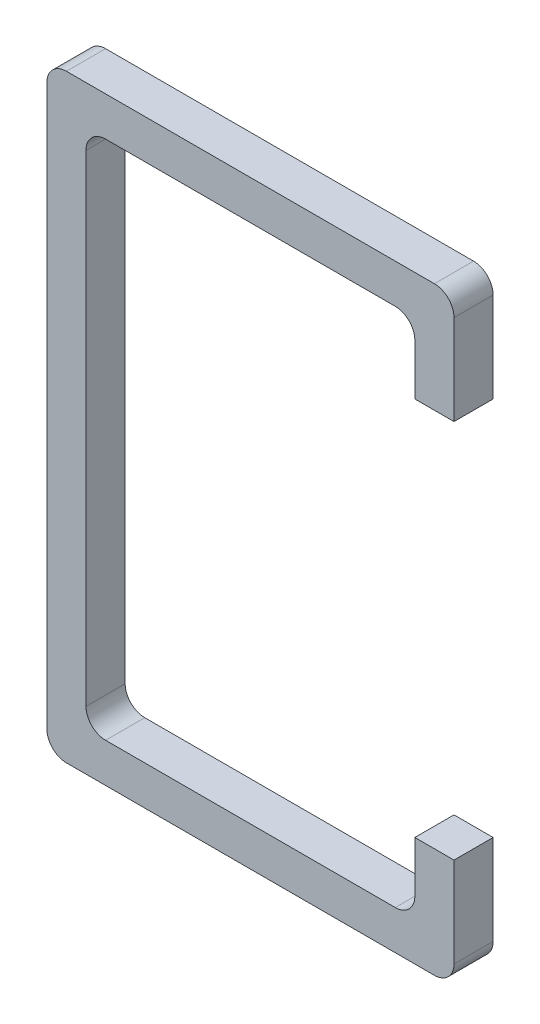
ISO-10303-21;
HEADER;
FILE_DESCRIPTION(('STEP AP214'),'2;1');
FILE_NAME('part.step','',(''),(''),'','','');
FILE_SCHEMA(('AUTOMOTIVE_DESIGN { 1 0 10303 214 1 1 1 1 }'));
ENDSEC;
DATA;
#1=APPLICATION_CONTEXT('core data for automotive mechanical design processes');
#2=APPLICATION_PROTOCOL_DEFINITION('international standard','automotive_design',2000,#1);
#3=PRODUCT_CONTEXT('',#1,'mechanical');
#4=PRODUCT('Part','Part','',(#3));
#5=PRODUCT_RELATED_PRODUCT_CATEGORY('part','',(#4));
#6=PRODUCT_DEFINITION_FORMATION('','',#4);
#7=PRODUCT_DEFINITION_CONTEXT('part definition',#1,'design');
#8=PRODUCT_DEFINITION('design','',#6,#7);
#9=PRODUCT_DEFINITION_SHAPE('','',#8);
#10=(LENGTH_UNIT() NAMED_UNIT(*) SI_UNIT(.MILLI.,.METRE.));
#11=(NAMED_UNIT(*) PLANE_ANGLE_UNIT() SI_UNIT($,.RADIAN.));
#12=(NAMED_UNIT(*) SI_UNIT($,.STERADIAN.) SOLID_ANGLE_UNIT());
#13=UNCERTAINTY_MEASURE_WITH_UNIT(LENGTH_MEASURE(1.E-05),#10,'distance_accuracy_value','');
#14=(GEOMETRIC_REPRESENTATION_CONTEXT(3) GLOBAL_UNCERTAINTY_ASSIGNED_CONTEXT((#13)) GLOBAL_UNIT_ASSIGNED_CONTEXT((#10,
#11,#12)) REPRESENTATION_CONTEXT('',''));
#15=CARTESIAN_POINT('',(0.,0.,0.));
#16=DIRECTION('',(0.,0.,1.));
#17=DIRECTION('',(1.,0.,0.));
#18=AXIS2_PLACEMENT_3D('',#15,#16,#17);
#19=CARTESIAN_POINT('',(77.6381074168798,18.9565217391304,10.));
#20=DIRECTION('',(-1.,0.,0.));
#21=DIRECTION('',(0.,0.,1.));
#22=AXIS2_PLACEMENT_3D('',#19,#20,#21);
#23=PLANE('',#22);
#24=DIRECTION('',(0.,1.,0.));
#25=VECTOR('',#24,1.);
#26=CARTESIAN_POINT('',(77.6381074168798,18.9565217391304,0.));
#27=LINE('',#26,#25);
#28=CARTESIAN_POINT('',(77.6381074168798,-9.04347826086956,0.));
#29=VERTEX_POINT('',#28);
#30=CARTESIAN_POINT('',(77.6381074168798,13.9565217391304,0.));
#31=VERTEX_POINT('',#30);
#32=EDGE_CURVE('E192',#29,#31,#27,.T.);
#33=ORIENTED_EDGE('',*,*,#32,.T.);
#34=DIRECTION('',(0.,0.,-1.));
#35=VECTOR('',#34,1.);
#36=CARTESIAN_POINT('',(77.6381074168798,13.9565217391304,10.));
#37=LINE('',#36,#35);
#38=CARTESIAN_POINT('',(77.6381074168798,13.9565217391304,10.));
#39=VERTEX_POINT('',#38);
#40=EDGE_CURVE('E347',#31,#39,#37,.F.);
#41=ORIENTED_EDGE('',*,*,#40,.T.);
#42=DIRECTION('',(0.,1.,0.));
#43=VECTOR('',#42,1.);
#44=CARTESIAN_POINT('',(77.6381074168798,18.9565217391304,10.));
#45=LINE('',#44,#43);
#46=CARTESIAN_POINT('',(77.6381074168798,-9.04347826086956,10.));
#47=VERTEX_POINT('',#46);
#48=EDGE_CURVE('E265',#47,#39,#45,.T.);
#49=ORIENTED_EDGE('',*,*,#48,.F.);
#50=DIRECTION('',(0.,0.,1.));
#51=VECTOR('',#50,1.);
#52=CARTESIAN_POINT('',(77.6381074168798,-9.04347826086956,0.));
#53=LINE('',#52,#51);
#54=EDGE_CURVE('E204',#29,#47,#53,.T.);
#55=ORIENTED_EDGE('',*,*,#54,.F.);
#56=EDGE_LOOP('',(#33,#41,#49,#55));
#57=FACE_BOUND('',#56,.T.);
#58=ADVANCED_FACE('F43',(#57),#23,.F.);
#59=CARTESIAN_POINT('',(67.6381074168798,8.95652173913044,0.));
#60=DIRECTION('',(1.,0.,0.));
#61=DIRECTION('',(0.,0.,-1.));
#62=AXIS2_PLACEMENT_3D('',#59,#60,#61);
#63=PLANE('',#62);
#64=DIRECTION('',(0.,1.,0.));
#65=VECTOR('',#64,1.);
#66=CARTESIAN_POINT('',(67.6381074168798,0.,10.));
#67=LINE('',#66,#65);
#68=CARTESIAN_POINT('',(67.6381074168798,-9.04347826086956,10.));
#69=VERTEX_POINT('',#68);
#70=CARTESIAN_POINT('',(67.6381074168798,3.95652173913044,10.));
#71=VERTEX_POINT('',#70);
#72=EDGE_CURVE('E246',#69,#71,#67,.T.);
#73=ORIENTED_EDGE('',*,*,#72,.T.);
#74=DIRECTION('',(0.,0.,1.));
#75=VECTOR('',#74,1.);
#76=CARTESIAN_POINT('',(67.6381074168798,3.95652173913044,0.));
#77=LINE('',#76,#75);
#78=CARTESIAN_POINT('',(67.6381074168798,3.95652173913044,0.));
#79=VERTEX_POINT('',#78);
#80=EDGE_CURVE('E315',#71,#79,#77,.F.);
#81=ORIENTED_EDGE('',*,*,#80,.T.);
#82=DIRECTION('',(0.,1.,0.));
#83=VECTOR('',#82,1.);
#84=CARTESIAN_POINT('',(67.6381074168798,8.95652173913044,0.));
#85=LINE('',#84,#83);
#86=CARTESIAN_POINT('',(67.6381074168798,-9.04347826086956,0.));
#87=VERTEX_POINT('',#86);
#88=EDGE_CURVE('E237',#87,#79,#85,.T.);
#89=ORIENTED_EDGE('',*,*,#88,.F.);
#90=DIRECTION('',(0.,0.,1.));
#91=VECTOR('',#90,1.);
#92=CARTESIAN_POINT('',(67.6381074168798,-9.04347826086956,0.));
#93=LINE('',#92,#91);
#94=EDGE_CURVE('E222',#87,#69,#93,.T.);
#95=ORIENTED_EDGE('',*,*,#94,.T.);
#96=EDGE_LOOP('',(#73,#81,#89,#95));
#97=FACE_BOUND('',#96,.T.);
#98=ADVANCED_FACE('F461',(#97),#63,.F.);
#99=CARTESIAN_POINT('',(-26.3618925831202,18.9565217391304,10.));
#100=DIRECTION('',(1.,0.,0.));
#101=DIRECTION('',(0.,1.,0.));
#102=AXIS2_PLACEMENT_3D('',#99,#100,#101);
#103=PLANE('',#102);
#104=DIRECTION('',(0.,-1.,0.));
#105=VECTOR('',#104,1.);
#106=CARTESIAN_POINT('',(-26.3618925831202,18.9565217391304,0.));
#107=LINE('',#106,#105);
#108=CARTESIAN_POINT('',(-26.3618925831202,13.9565217391304,0.));
#109=VERTEX_POINT('',#108);
#110=CARTESIAN_POINT('',(-26.3618925831202,-129.04347826087,0.));
#111=VERTEX_POINT('',#110);
#112=EDGE_CURVE('E256',#109,#111,#107,.T.);
#113=ORIENTED_EDGE('',*,*,#112,.T.);
#114=DIRECTION('',(0.,0.,-1.));
#115=VECTOR('',#114,1.);
#116=CARTESIAN_POINT('',(-26.3618925831202,-129.04347826087,10.));
#117=LINE('',#116,#115);
#118=CARTESIAN_POINT('',(-26.3618925831202,-129.04347826087,10.));
#119=VERTEX_POINT('',#118);
#120=EDGE_CURVE('E334',#111,#119,#117,.F.);
#121=ORIENTED_EDGE('',*,*,#120,.T.);
#122=DIRECTION('',(0.,-1.,0.));
#123=VECTOR('',#122,1.);
#124=CARTESIAN_POINT('',(-26.3618925831202,18.9565217391304,10.));
#125=LINE('',#124,#123);
#126=CARTESIAN_POINT('',(-26.3618925831202,13.9565217391304,10.));
#127=VERTEX_POINT('',#126);
#128=EDGE_CURVE('E257',#127,#119,#125,.T.);
#129=ORIENTED_EDGE('',*,*,#128,.F.);
#130=DIRECTION('',(0.,0.,-1.));
#131=VECTOR('',#130,1.);
#132=CARTESIAN_POINT('',(-26.3618925831202,13.9565217391304,10.));
#133=LINE('',#132,#131);
#134=EDGE_CURVE('E296',#127,#109,#133,.T.);
#135=ORIENTED_EDGE('',*,*,#134,.T.);
#136=EDGE_LOOP('',(#113,#121,#129,#135));
#137=FACE_BOUND('',#136,.T.);
#138=ADVANCED_FACE('F439',(#137),#103,.F.);
#139=CARTESIAN_POINT('',(-26.3618925831202,-134.04347826087,10.));
#140=DIRECTION('',(0.,1.,0.));
#141=DIRECTION('',(0.,0.,1.));
#142=AXIS2_PLACEMENT_3D('',#139,#140,#141);
#143=PLANE('',#142);
#144=DIRECTION('',(1.,0.,0.));
#145=VECTOR('',#144,1.);
#146=CARTESIAN_POINT('',(-26.3618925831202,-134.04347826087,0.));
#147=LINE('',#146,#145);
#148=CARTESIAN_POINT('',(-21.3618925831202,-134.04347826087,0.));
#149=VERTEX_POINT('',#148);
#150=CARTESIAN_POINT('',(72.6381074168798,-134.04347826087,0.));
#151=VERTEX_POINT('',#150);
#152=EDGE_CURVE('E276',#149,#151,#147,.T.);
#153=ORIENTED_EDGE('',*,*,#152,.T.);
#154=DIRECTION('',(0.,0.,-1.));
#155=VECTOR('',#154,1.);
#156=CARTESIAN_POINT('',(72.6381074168798,-134.04347826087,10.));
#157=LINE('',#156,#155);
#158=CARTESIAN_POINT('',(72.6381074168798,-134.04347826087,10.));
#159=VERTEX_POINT('',#158);
#160=EDGE_CURVE('E370',#151,#159,#157,.F.);
#161=ORIENTED_EDGE('',*,*,#160,.T.);
#162=DIRECTION('',(1.,0.,0.));
#163=VECTOR('',#162,1.);
#164=CARTESIAN_POINT('',(-26.3618925831202,-134.04347826087,10.));
#165=LINE('',#164,#163);
#166=CARTESIAN_POINT('',(-21.3618925831202,-134.04347826087,10.));
#167=VERTEX_POINT('',#166);
#168=EDGE_CURVE('E261',#167,#159,#165,.T.);
#169=ORIENTED_EDGE('',*,*,#168,.F.);
#170=DIRECTION('',(0.,0.,-1.));
#171=VECTOR('',#170,1.);
#172=CARTESIAN_POINT('',(-21.3618925831202,-134.04347826087,10.));
#173=LINE('',#172,#171);
#174=EDGE_CURVE('E324',#167,#149,#173,.T.);
#175=ORIENTED_EDGE('',*,*,#174,.T.);
#176=EDGE_LOOP('',(#153,#161,#169,#175));
#177=FACE_BOUND('',#176,.T.);
#178=ADVANCED_FACE('F430',(#177),#143,.F.);
#179=CARTESIAN_POINT('',(77.6381074168798,-129.04347826087,10.));
#180=VERTEX_POINT('',#179);
#181=CARTESIAN_POINT('',(77.6381074168798,-106.04347826087,10.));
#182=VERTEX_POINT('',#181);
#183=EDGE_CURVE('E266',#180,#182,#45,.T.);
#184=ORIENTED_EDGE('',*,*,#183,.F.);
#185=DIRECTION('',(0.,0.,-1.));
#186=VECTOR('',#185,1.);
#187=CARTESIAN_POINT('',(77.6381074168798,-129.04347826087,10.));
#188=LINE('',#187,#186);
#189=CARTESIAN_POINT('',(77.6381074168798,-129.04347826087,0.));
#190=VERTEX_POINT('',#189);
#191=EDGE_CURVE('E187',#180,#190,#188,.T.);
#192=ORIENTED_EDGE('',*,*,#191,.T.);
#193=CARTESIAN_POINT('',(77.6381074168798,-106.04347826087,0.));
#194=VERTEX_POINT('',#193);
#195=EDGE_CURVE('E181',#190,#194,#27,.T.);
#196=ORIENTED_EDGE('',*,*,#195,.T.);
#197=DIRECTION('',(0.,0.,1.));
#198=VECTOR('',#197,1.);
#199=CARTESIAN_POINT('',(77.6381074168798,-106.04347826087,0.));
#200=LINE('',#199,#198);
#201=EDGE_CURVE('E185',#194,#182,#200,.T.);
#202=ORIENTED_EDGE('',*,*,#201,.T.);
#203=EDGE_LOOP('',(#184,#192,#196,#202));
#204=FACE_BOUND('',#203,.T.);
#205=ADVANCED_FACE('F184',(#204),#23,.F.);
#206=CARTESIAN_POINT('',(-26.3618925831202,18.9565217391304,10.));
#207=DIRECTION('',(0.,-1.,0.));
#208=DIRECTION('',(0.,0.,-1.));
#209=AXIS2_PLACEMENT_3D('',#206,#207,#208);
#210=PLANE('',#209);
#211=DIRECTION('',(-1.,0.,0.));
#212=VECTOR('',#211,1.);
#213=CARTESIAN_POINT('',(-26.3618925831202,18.9565217391304,10.));
#214=LINE('',#213,#212);
#215=CARTESIAN_POINT('',(72.6381074168798,18.9565217391304,10.));
#216=VERTEX_POINT('',#215);
#217=CARTESIAN_POINT('',(-21.3618925831202,18.9565217391304,10.));
#218=VERTEX_POINT('',#217);
#219=EDGE_CURVE('E269',#216,#218,#214,.T.);
#220=ORIENTED_EDGE('',*,*,#219,.F.);
#221=DIRECTION('',(0.,0.,-1.));
#222=VECTOR('',#221,1.);
#223=CARTESIAN_POINT('',(72.6381074168798,18.9565217391304,10.));
#224=LINE('',#223,#222);
#225=CARTESIAN_POINT('',(72.6381074168798,18.9565217391304,0.));
#226=VERTEX_POINT('',#225);
#227=EDGE_CURVE('E343',#216,#226,#224,.T.);
#228=ORIENTED_EDGE('',*,*,#227,.T.);
#229=DIRECTION('',(-1.,0.,0.));
#230=VECTOR('',#229,1.);
#231=CARTESIAN_POINT('',(-26.3618925831202,18.9565217391304,0.));
#232=LINE('',#231,#230);
#233=CARTESIAN_POINT('',(-21.3618925831202,18.9565217391304,0.));
#234=VERTEX_POINT('',#233);
#235=EDGE_CURVE('E191',#226,#234,#232,.T.);
#236=ORIENTED_EDGE('',*,*,#235,.T.);
#237=DIRECTION('',(0.,0.,-1.));
#238=VECTOR('',#237,1.);
#239=CARTESIAN_POINT('',(-21.3618925831202,18.9565217391304,10.));
#240=LINE('',#239,#238);
#241=EDGE_CURVE('E304',#234,#218,#240,.F.);
#242=ORIENTED_EDGE('',*,*,#241,.T.);
#243=EDGE_LOOP('',(#220,#228,#236,#242));
#244=FACE_BOUND('',#243,.T.);
#245=ADVANCED_FACE('F449',(#244),#210,.F.);
#246=CARTESIAN_POINT('',(0.,0.,10.));
#247=DIRECTION('',(0.,0.,1.));
#248=DIRECTION('',(1.,0.,0.));
#249=AXIS2_PLACEMENT_3D('',#246,#247,#248);
#250=PLANE('',#249);
#251=ORIENTED_EDGE('',*,*,#168,.T.);
#252=CARTESIAN_POINT('',(72.6381074168798,-129.04347826087,10.));
#253=DIRECTION('',(0.,0.,1.));
#254=DIRECTION('',(1.,0.,0.));
#255=AXIS2_PLACEMENT_3D('',#252,#253,#254);
#256=CIRCLE('',#255,5.);
#257=EDGE_CURVE('E373',#159,#180,#256,.T.);
#258=ORIENTED_EDGE('',*,*,#257,.T.);
#259=ORIENTED_EDGE('',*,*,#183,.T.);
#260=DIRECTION('',(1.,0.,0.));
#261=VECTOR('',#260,1.);
#262=CARTESIAN_POINT('',(67.6381074168798,-106.04347826087,10.));
#263=LINE('',#262,#261);
#264=CARTESIAN_POINT('',(67.6381074168798,-106.04347826087,10.));
#265=VERTEX_POINT('',#264);
#266=EDGE_CURVE('E202',#265,#182,#263,.T.);
#267=ORIENTED_EDGE('',*,*,#266,.F.);
#268=CARTESIAN_POINT('',(67.6381074168798,-119.04347826087,10.));
#269=VERTEX_POINT('',#268);
#270=EDGE_CURVE('E247',#269,#265,#67,.T.);
#271=ORIENTED_EDGE('',*,*,#270,.F.);
#272=CARTESIAN_POINT('',(62.6381074168798,-119.04347826087,10.));
#273=DIRECTION('',(0.,0.,1.));
#274=DIRECTION('',(1.,0.,0.));
#275=AXIS2_PLACEMENT_3D('',#272,#273,#274);
#276=CIRCLE('',#275,5.);
#277=CARTESIAN_POINT('',(62.6381074168798,-124.04347826087,10.));
#278=VERTEX_POINT('',#277);
#279=EDGE_CURVE('E358',#269,#278,#276,.F.);
#280=ORIENTED_EDGE('',*,*,#279,.T.);
#281=DIRECTION('',(1.,0.,0.));
#282=VECTOR('',#281,1.);
#283=CARTESIAN_POINT('',(0.,-124.04347826087,10.));
#284=LINE('',#283,#282);
#285=CARTESIAN_POINT('',(-11.3618925831202,-124.04347826087,10.));
#286=VERTEX_POINT('',#285);
#287=EDGE_CURVE('E243',#286,#278,#284,.T.);
#288=ORIENTED_EDGE('',*,*,#287,.F.);
#289=CARTESIAN_POINT('',(-11.3618925831202,-119.04347826087,10.));
#290=DIRECTION('',(0.,0.,1.));
#291=DIRECTION('',(1.,0.,0.));
#292=AXIS2_PLACEMENT_3D('',#289,#290,#291);
#293=CIRCLE('',#292,5.);
#294=CARTESIAN_POINT('',(-16.3618925831202,-119.04347826087,10.));
#295=VERTEX_POINT('',#294);
#296=EDGE_CURVE('E52',#286,#295,#293,.F.);
#297=ORIENTED_EDGE('',*,*,#296,.T.);
#298=DIRECTION('',(0.,-1.,0.));
#299=VECTOR('',#298,1.);
#300=CARTESIAN_POINT('',(-16.3618925831202,0.,10.));
#301=LINE('',#300,#299);
#302=CARTESIAN_POINT('',(-16.3618925831202,3.95652173913044,10.));
#303=VERTEX_POINT('',#302);
#304=EDGE_CURVE('E253',#303,#295,#301,.T.);
#305=ORIENTED_EDGE('',*,*,#304,.F.);
#306=CARTESIAN_POINT('',(-11.3618925831202,3.95652173913044,10.));
#307=DIRECTION('',(0.,0.,1.));
#308=DIRECTION('',(1.,0.,0.));
#309=AXIS2_PLACEMENT_3D('',#306,#307,#308);
#310=CIRCLE('',#309,5.);
#311=CARTESIAN_POINT('',(-11.3618925831202,8.95652173913044,10.));
#312=VERTEX_POINT('',#311);
#313=EDGE_CURVE('E289',#303,#312,#310,.F.);
#314=ORIENTED_EDGE('',*,*,#313,.T.);
#315=DIRECTION('',(-1.,0.,0.));
#316=VECTOR('',#315,1.);
#317=CARTESIAN_POINT('',(0.,8.95652173913044,10.));
#318=LINE('',#317,#316);
#319=CARTESIAN_POINT('',(62.6381074168798,8.95652173913044,10.));
#320=VERTEX_POINT('',#319);
#321=EDGE_CURVE('E250',#320,#312,#318,.T.);
#322=ORIENTED_EDGE('',*,*,#321,.F.);
#323=CARTESIAN_POINT('',(62.6381074168798,3.95652173913044,10.));
#324=DIRECTION('',(0.,0.,1.));
#325=DIRECTION('',(1.,0.,0.));
#326=AXIS2_PLACEMENT_3D('',#323,#324,#325);
#327=CIRCLE('',#326,5.);
#328=EDGE_CURVE('E318',#320,#71,#327,.F.);
#329=ORIENTED_EDGE('',*,*,#328,.T.);
#330=ORIENTED_EDGE('',*,*,#72,.F.);
#331=DIRECTION('',(-1.,0.,0.));
#332=VECTOR('',#331,1.);
#333=CARTESIAN_POINT('',(67.6381074168798,-9.04347826086956,10.));
#334=LINE('',#333,#332);
#335=EDGE_CURVE('E212',#47,#69,#334,.T.);
#336=ORIENTED_EDGE('',*,*,#335,.F.);
#337=ORIENTED_EDGE('',*,*,#48,.T.);
#338=CARTESIAN_POINT('',(72.6381074168798,13.9565217391304,10.));
#339=DIRECTION('',(0.,0.,1.));
#340=DIRECTION('',(1.,0.,0.));
#341=AXIS2_PLACEMENT_3D('',#338,#339,#340);
#342=CIRCLE('',#341,5.);
#343=EDGE_CURVE('E337',#39,#216,#342,.T.);
#344=ORIENTED_EDGE('',*,*,#343,.T.);
#345=ORIENTED_EDGE('',*,*,#219,.T.);
#346=CARTESIAN_POINT('',(-21.3618925831202,13.9565217391304,10.));
#347=DIRECTION('',(0.,0.,1.));
#348=DIRECTION('',(1.,0.,0.));
#349=AXIS2_PLACEMENT_3D('',#346,#347,#348);
#350=CIRCLE('',#349,5.);
#351=EDGE_CURVE('E308',#218,#127,#350,.T.);
#352=ORIENTED_EDGE('',*,*,#351,.T.);
#353=ORIENTED_EDGE('',*,*,#128,.T.);
#354=CARTESIAN_POINT('',(-21.3618925831202,-129.04347826087,10.));
#355=DIRECTION('',(0.,0.,1.));
#356=DIRECTION('',(1.,0.,0.));
#357=AXIS2_PLACEMENT_3D('',#354,#355,#356);
#358=CIRCLE('',#357,5.);
#359=EDGE_CURVE('E340',#119,#167,#358,.T.);
#360=ORIENTED_EDGE('',*,*,#359,.T.);
#361=EDGE_LOOP('',(#251,#258,#259,#267,#271,#280,#288,#297,#305,#314,#322,#329,#330,#336,#337,
#344,#345,#352,#353,#360));
#362=FACE_BOUND('',#361,.T.);
#363=ADVANCED_FACE('F402',(#362),#250,.T.);
#364=CARTESIAN_POINT('',(0.,0.,0.));
#365=DIRECTION('',(0.,0.,1.));
#366=DIRECTION('',(1.,0.,0.));
#367=AXIS2_PLACEMENT_3D('',#364,#365,#366);
#368=PLANE('',#367);
#369=ORIENTED_EDGE('',*,*,#195,.F.);
#370=CARTESIAN_POINT('',(72.6381074168798,-129.04347826087,0.));
#371=DIRECTION('',(0.,0.,1.));
#372=DIRECTION('',(1.,0.,0.));
#373=AXIS2_PLACEMENT_3D('',#370,#371,#372);
#374=CIRCLE('',#373,5.);
#375=EDGE_CURVE('E367',#190,#151,#374,.F.);
#376=ORIENTED_EDGE('',*,*,#375,.T.);
#377=ORIENTED_EDGE('',*,*,#152,.F.);
#378=CARTESIAN_POINT('',(-21.3618925831202,-129.04347826087,0.));
#379=DIRECTION('',(0.,0.,1.));
#380=DIRECTION('',(1.,0.,0.));
#381=AXIS2_PLACEMENT_3D('',#378,#379,#380);
#382=CIRCLE('',#381,5.);
#383=EDGE_CURVE('E331',#149,#111,#382,.F.);
#384=ORIENTED_EDGE('',*,*,#383,.T.);
#385=ORIENTED_EDGE('',*,*,#112,.F.);
#386=CARTESIAN_POINT('',(-21.3618925831202,13.9565217391304,0.));
#387=DIRECTION('',(0.,0.,1.));
#388=DIRECTION('',(1.,0.,0.));
#389=AXIS2_PLACEMENT_3D('',#386,#387,#388);
#390=CIRCLE('',#389,5.);
#391=EDGE_CURVE('E300',#109,#234,#390,.F.);
#392=ORIENTED_EDGE('',*,*,#391,.T.);
#393=ORIENTED_EDGE('',*,*,#235,.F.);
#394=CARTESIAN_POINT('',(72.6381074168798,13.9565217391304,0.));
#395=DIRECTION('',(0.,0.,1.));
#396=DIRECTION('',(1.,0.,0.));
#397=AXIS2_PLACEMENT_3D('',#394,#395,#396);
#398=CIRCLE('',#397,5.);
#399=EDGE_CURVE('E328',#226,#31,#398,.F.);
#400=ORIENTED_EDGE('',*,*,#399,.T.);
#401=ORIENTED_EDGE('',*,*,#32,.F.);
#402=DIRECTION('',(-1.,0.,0.));
#403=VECTOR('',#402,1.);
#404=CARTESIAN_POINT('',(67.6381074168798,-9.04347826086956,0.));
#405=LINE('',#404,#403);
#406=EDGE_CURVE('E211',#29,#87,#405,.T.);
#407=ORIENTED_EDGE('',*,*,#406,.T.);
#408=ORIENTED_EDGE('',*,*,#88,.T.);
#409=CARTESIAN_POINT('',(62.6381074168798,3.95652173913044,0.));
#410=DIRECTION('',(0.,0.,1.));
#411=DIRECTION('',(1.,0.,0.));
#412=AXIS2_PLACEMENT_3D('',#409,#410,#411);
#413=CIRCLE('',#412,5.);
#414=CARTESIAN_POINT('',(62.6381074168798,8.95652173913044,0.));
#415=VERTEX_POINT('',#414);
#416=EDGE_CURVE('E321',#79,#415,#413,.T.);
#417=ORIENTED_EDGE('',*,*,#416,.T.);
#418=DIRECTION('',(-1.,0.,0.));
#419=VECTOR('',#418,1.);
#420=CARTESIAN_POINT('',(-16.3618925831202,8.95652173913044,0.));
#421=LINE('',#420,#419);
#422=CARTESIAN_POINT('',(-11.3618925831202,8.95652173913044,0.));
#423=VERTEX_POINT('',#422);
#424=EDGE_CURVE('E240',#415,#423,#421,.T.);
#425=ORIENTED_EDGE('',*,*,#424,.T.);
#426=CARTESIAN_POINT('',(-11.3618925831202,3.95652173913044,0.));
#427=DIRECTION('',(0.,0.,1.));
#428=DIRECTION('',(1.,0.,0.));
#429=AXIS2_PLACEMENT_3D('',#426,#427,#428);
#430=CIRCLE('',#429,5.);
#431=CARTESIAN_POINT('',(-16.3618925831202,3.95652173913044,0.));
#432=VERTEX_POINT('',#431);
#433=EDGE_CURVE('E293',#423,#432,#430,.T.);
#434=ORIENTED_EDGE('',*,*,#433,.T.);
#435=DIRECTION('',(0.,-1.,0.));
#436=VECTOR('',#435,1.);
#437=CARTESIAN_POINT('',(-16.3618925831202,8.95652173913044,0.));
#438=LINE('',#437,#436);
#439=CARTESIAN_POINT('',(-16.3618925831202,-119.04347826087,0.));
#440=VERTEX_POINT('',#439);
#441=EDGE_CURVE('E226',#432,#440,#438,.T.);
#442=ORIENTED_EDGE('',*,*,#441,.T.);
#443=CARTESIAN_POINT('',(-11.3618925831202,-119.04347826087,0.));
#444=DIRECTION('',(0.,0.,1.));
#445=DIRECTION('',(1.,0.,0.));
#446=AXIS2_PLACEMENT_3D('',#443,#444,#445);
#447=CIRCLE('',#446,5.);
#448=CARTESIAN_POINT('',(-11.3618925831202,-124.04347826087,0.));
#449=VERTEX_POINT('',#448);
#450=EDGE_CURVE('E11',#440,#449,#447,.T.);
#451=ORIENTED_EDGE('',*,*,#450,.T.);
#452=DIRECTION('',(1.,0.,0.));
#453=VECTOR('',#452,1.);
#454=CARTESIAN_POINT('',(-16.3618925831202,-124.04347826087,0.));
#455=LINE('',#454,#453);
#456=CARTESIAN_POINT('',(62.6381074168798,-124.04347826087,0.));
#457=VERTEX_POINT('',#456);
#458=EDGE_CURVE('E234',#449,#457,#455,.T.);
#459=ORIENTED_EDGE('',*,*,#458,.T.);
#460=CARTESIAN_POINT('',(62.6381074168798,-119.04347826087,0.));
#461=DIRECTION('',(0.,0.,1.));
#462=DIRECTION('',(1.,0.,0.));
#463=AXIS2_PLACEMENT_3D('',#460,#461,#462);
#464=CIRCLE('',#463,5.);
#465=CARTESIAN_POINT('',(67.6381074168798,-119.04347826087,0.));
#466=VERTEX_POINT('',#465);
#467=EDGE_CURVE('E362',#457,#466,#464,.T.);
#468=ORIENTED_EDGE('',*,*,#467,.T.);
#469=CARTESIAN_POINT('',(67.6381074168798,-106.04347826087,0.));
#470=VERTEX_POINT('',#469);
#471=EDGE_CURVE('E209',#466,#470,#85,.T.);
#472=ORIENTED_EDGE('',*,*,#471,.T.);
#473=DIRECTION('',(1.,0.,0.));
#474=VECTOR('',#473,1.);
#475=CARTESIAN_POINT('',(67.6381074168798,-106.04347826087,0.));
#476=LINE('',#475,#474);
#477=EDGE_CURVE('E199',#470,#194,#476,.T.);
#478=ORIENTED_EDGE('',*,*,#477,.T.);
#479=EDGE_LOOP('',(#369,#376,#377,#384,#385,#392,#393,#400,#401,#407,#408,#417,#425,#434,#442,
#451,#459,#468,#472,#478));
#480=FACE_BOUND('',#479,.T.);
#481=ADVANCED_FACE('F207',(#480),#368,.F.);
#482=CARTESIAN_POINT('',(-16.3618925831202,8.95652173913044,0.));
#483=DIRECTION('',(-1.,0.,0.));
#484=DIRECTION('',(0.,-1.,0.));
#485=AXIS2_PLACEMENT_3D('',#482,#483,#484);
#486=PLANE('',#485);
#487=ORIENTED_EDGE('',*,*,#304,.T.);
#488=DIRECTION('',(0.,0.,1.));
#489=VECTOR('',#488,1.);
#490=CARTESIAN_POINT('',(-16.3618925831202,-119.04347826087,0.));
#491=LINE('',#490,#489);
#492=EDGE_CURVE('E379',#295,#440,#491,.F.);
#493=ORIENTED_EDGE('',*,*,#492,.T.);
#494=ORIENTED_EDGE('',*,*,#441,.F.);
#495=DIRECTION('',(0.,0.,1.));
#496=VECTOR('',#495,1.);
#497=CARTESIAN_POINT('',(-16.3618925831202,3.95652173913044,10.));
#498=LINE('',#497,#496);
#499=EDGE_CURVE('E272',#432,#303,#498,.T.);
#500=ORIENTED_EDGE('',*,*,#499,.T.);
#501=EDGE_LOOP('',(#487,#493,#494,#500));
#502=FACE_BOUND('',#501,.T.);
#503=ADVANCED_FACE('F412',(#502),#486,.F.);
#504=CARTESIAN_POINT('',(-16.3618925831202,8.95652173913044,0.));
#505=DIRECTION('',(0.,1.,0.));
#506=DIRECTION('',(0.,0.,1.));
#507=AXIS2_PLACEMENT_3D('',#504,#505,#506);
#508=PLANE('',#507);
#509=ORIENTED_EDGE('',*,*,#424,.F.);
#510=DIRECTION('',(0.,0.,1.));
#511=VECTOR('',#510,1.);
#512=CARTESIAN_POINT('',(62.6381074168798,8.95652173913044,10.));
#513=LINE('',#512,#511);
#514=EDGE_CURVE('E311',#415,#320,#513,.T.);
#515=ORIENTED_EDGE('',*,*,#514,.T.);
#516=ORIENTED_EDGE('',*,*,#321,.T.);
#517=DIRECTION('',(0.,0.,1.));
#518=VECTOR('',#517,1.);
#519=CARTESIAN_POINT('',(-11.3618925831202,8.95652173913044,0.));
#520=LINE('',#519,#518);
#521=EDGE_CURVE('E285',#312,#423,#520,.F.);
#522=ORIENTED_EDGE('',*,*,#521,.T.);
#523=EDGE_LOOP('',(#509,#515,#516,#522));
#524=FACE_BOUND('',#523,.T.);
#525=ADVANCED_FACE('F401',(#524),#508,.F.);
#526=ORIENTED_EDGE('',*,*,#471,.F.);
#527=DIRECTION('',(0.,0.,1.));
#528=VECTOR('',#527,1.);
#529=CARTESIAN_POINT('',(67.6381074168798,-119.04347826087,10.));
#530=LINE('',#529,#528);
#531=EDGE_CURVE('E350',#466,#269,#530,.T.);
#532=ORIENTED_EDGE('',*,*,#531,.T.);
#533=ORIENTED_EDGE('',*,*,#270,.T.);
#534=DIRECTION('',(0.,0.,1.));
#535=VECTOR('',#534,1.);
#536=CARTESIAN_POINT('',(67.6381074168798,-106.04347826087,0.));
#537=LINE('',#536,#535);
#538=EDGE_CURVE('E205',#470,#265,#537,.T.);
#539=ORIENTED_EDGE('',*,*,#538,.F.);
#540=EDGE_LOOP('',(#526,#532,#533,#539));
#541=FACE_BOUND('',#540,.T.);
#542=ADVANCED_FACE('F422',(#541),#63,.F.);
#543=CARTESIAN_POINT('',(-16.3618925831202,-124.04347826087,0.));
#544=DIRECTION('',(0.,-1.,0.));
#545=DIRECTION('',(0.,0.,-1.));
#546=AXIS2_PLACEMENT_3D('',#543,#544,#545);
#547=PLANE('',#546);
#548=ORIENTED_EDGE('',*,*,#458,.F.);
#549=DIRECTION('',(0.,0.,1.));
#550=VECTOR('',#549,1.);
#551=CARTESIAN_POINT('',(-11.3618925831202,-124.04347826087,10.));
#552=LINE('',#551,#550);
#553=EDGE_CURVE('E376',#449,#286,#552,.T.);
#554=ORIENTED_EDGE('',*,*,#553,.T.);
#555=ORIENTED_EDGE('',*,*,#287,.T.);
#556=DIRECTION('',(0.,0.,1.));
#557=VECTOR('',#556,1.);
#558=CARTESIAN_POINT('',(62.6381074168798,-124.04347826087,0.));
#559=LINE('',#558,#557);
#560=EDGE_CURVE('E354',#278,#457,#559,.F.);
#561=ORIENTED_EDGE('',*,*,#560,.T.);
#562=EDGE_LOOP('',(#548,#554,#555,#561));
#563=FACE_BOUND('',#562,.T.);
#564=ADVANCED_FACE('F415',(#563),#547,.F.);
#565=CARTESIAN_POINT('',(67.6381074168798,-106.04347826087,0.));
#566=DIRECTION('',(0.,-1.,0.));
#567=DIRECTION('',(0.,0.,-1.));
#568=AXIS2_PLACEMENT_3D('',#565,#566,#567);
#569=PLANE('',#568);
#570=ORIENTED_EDGE('',*,*,#266,.T.);
#571=ORIENTED_EDGE('',*,*,#201,.F.);
#572=ORIENTED_EDGE('',*,*,#477,.F.);
#573=ORIENTED_EDGE('',*,*,#538,.T.);
#574=EDGE_LOOP('',(#570,#571,#572,#573));
#575=FACE_BOUND('',#574,.T.);
#576=ADVANCED_FACE('F197',(#575),#569,.F.);
#577=CARTESIAN_POINT('',(67.6381074168798,-9.04347826086956,0.));
#578=DIRECTION('',(0.,1.,0.));
#579=DIRECTION('',(-1.,0.,0.));
#580=AXIS2_PLACEMENT_3D('',#577,#578,#579);
#581=PLANE('',#580);
#582=ORIENTED_EDGE('',*,*,#335,.T.);
#583=ORIENTED_EDGE('',*,*,#94,.F.);
#584=ORIENTED_EDGE('',*,*,#406,.F.);
#585=ORIENTED_EDGE('',*,*,#54,.T.);
#586=EDGE_LOOP('',(#582,#583,#584,#585));
#587=FACE_BOUND('',#586,.T.);
#588=ADVANCED_FACE('F460',(#587),#581,.F.);
#589=CARTESIAN_POINT('',(-11.3618925831202,3.95652173913044,0.));
#590=DIRECTION('',(0.,0.,-1.));
#591=DIRECTION('',(-1.,0.,0.));
#592=AXIS2_PLACEMENT_3D('',#589,#590,#591);
#593=CYLINDRICAL_SURFACE('',#592,5.);
#594=ORIENTED_EDGE('',*,*,#433,.F.);
#595=ORIENTED_EDGE('',*,*,#521,.F.);
#596=ORIENTED_EDGE('',*,*,#313,.F.);
#597=ORIENTED_EDGE('',*,*,#499,.F.);
#598=EDGE_LOOP('',(#594,#595,#596,#597));
#599=FACE_BOUND('',#598,.T.);
#600=ADVANCED_FACE('F408',(#599),#593,.F.);
#601=CARTESIAN_POINT('',(-21.3618925831202,13.9565217391304,10.));
#602=DIRECTION('',(0.,0.,-1.));
#603=DIRECTION('',(-1.,0.,0.));
#604=AXIS2_PLACEMENT_3D('',#601,#602,#603);
#605=CYLINDRICAL_SURFACE('',#604,5.);
#606=ORIENTED_EDGE('',*,*,#351,.F.);
#607=ORIENTED_EDGE('',*,*,#241,.F.);
#608=ORIENTED_EDGE('',*,*,#391,.F.);
#609=ORIENTED_EDGE('',*,*,#134,.F.);
#610=EDGE_LOOP('',(#606,#607,#608,#609));
#611=FACE_BOUND('',#610,.T.);
#612=ADVANCED_FACE('F444',(#611),#605,.T.);
#613=CARTESIAN_POINT('',(62.6381074168798,3.95652173913044,0.));
#614=DIRECTION('',(0.,0.,-1.));
#615=DIRECTION('',(-1.,0.,0.));
#616=AXIS2_PLACEMENT_3D('',#613,#614,#615);
#617=CYLINDRICAL_SURFACE('',#616,5.);
#618=ORIENTED_EDGE('',*,*,#416,.F.);
#619=ORIENTED_EDGE('',*,*,#80,.F.);
#620=ORIENTED_EDGE('',*,*,#328,.F.);
#621=ORIENTED_EDGE('',*,*,#514,.F.);
#622=EDGE_LOOP('',(#618,#619,#620,#621));
#623=FACE_BOUND('',#622,.T.);
#624=ADVANCED_FACE('F398',(#623),#617,.F.);
#625=CARTESIAN_POINT('',(-21.3618925831202,-129.04347826087,10.));
#626=DIRECTION('',(0.,0.,-1.));
#627=DIRECTION('',(-1.,0.,0.));
#628=AXIS2_PLACEMENT_3D('',#625,#626,#627);
#629=CYLINDRICAL_SURFACE('',#628,5.);
#630=ORIENTED_EDGE('',*,*,#359,.F.);
#631=ORIENTED_EDGE('',*,*,#120,.F.);
#632=ORIENTED_EDGE('',*,*,#383,.F.);
#633=ORIENTED_EDGE('',*,*,#174,.F.);
#634=EDGE_LOOP('',(#630,#631,#632,#633));
#635=FACE_BOUND('',#634,.T.);
#636=ADVANCED_FACE('F435',(#635),#629,.T.);
#637=CARTESIAN_POINT('',(72.6381074168798,13.9565217391304,10.));
#638=DIRECTION('',(0.,0.,-1.));
#639=DIRECTION('',(-1.,0.,0.));
#640=AXIS2_PLACEMENT_3D('',#637,#638,#639);
#641=CYLINDRICAL_SURFACE('',#640,5.);
#642=ORIENTED_EDGE('',*,*,#343,.F.);
#643=ORIENTED_EDGE('',*,*,#40,.F.);
#644=ORIENTED_EDGE('',*,*,#399,.F.);
#645=ORIENTED_EDGE('',*,*,#227,.F.);
#646=EDGE_LOOP('',(#642,#643,#644,#645));
#647=FACE_BOUND('',#646,.T.);
#648=ADVANCED_FACE('F453',(#647),#641,.T.);
#649=CARTESIAN_POINT('',(62.6381074168798,-119.04347826087,0.));
#650=DIRECTION('',(0.,0.,-1.));
#651=DIRECTION('',(-1.,0.,0.));
#652=AXIS2_PLACEMENT_3D('',#649,#650,#651);
#653=CYLINDRICAL_SURFACE('',#652,5.);
#654=ORIENTED_EDGE('',*,*,#467,.F.);
#655=ORIENTED_EDGE('',*,*,#560,.F.);
#656=ORIENTED_EDGE('',*,*,#279,.F.);
#657=ORIENTED_EDGE('',*,*,#531,.F.);
#658=EDGE_LOOP('',(#654,#655,#656,#657));
#659=FACE_BOUND('',#658,.T.);
#660=ADVANCED_FACE('F420',(#659),#653,.F.);
#661=CARTESIAN_POINT('',(72.6381074168798,-129.04347826087,10.));
#662=DIRECTION('',(0.,0.,-1.));
#663=DIRECTION('',(-1.,0.,0.));
#664=AXIS2_PLACEMENT_3D('',#661,#662,#663);
#665=CYLINDRICAL_SURFACE('',#664,5.);
#666=ORIENTED_EDGE('',*,*,#257,.F.);
#667=ORIENTED_EDGE('',*,*,#160,.F.);
#668=ORIENTED_EDGE('',*,*,#375,.F.);
#669=ORIENTED_EDGE('',*,*,#191,.F.);
#670=EDGE_LOOP('',(#666,#667,#668,#669));
#671=FACE_BOUND('',#670,.T.);
#672=ADVANCED_FACE('F426',(#671),#665,.T.);
#673=CARTESIAN_POINT('',(-11.3618925831202,-119.04347826087,0.));
#674=DIRECTION('',(0.,0.,-1.));
#675=DIRECTION('',(-1.,0.,0.));
#676=AXIS2_PLACEMENT_3D('',#673,#674,#675);
#677=CYLINDRICAL_SURFACE('',#676,5.);
#678=ORIENTED_EDGE('',*,*,#450,.F.);
#679=ORIENTED_EDGE('',*,*,#492,.F.);
#680=ORIENTED_EDGE('',*,*,#296,.F.);
#681=ORIENTED_EDGE('',*,*,#553,.F.);
#682=EDGE_LOOP('',(#678,#679,#680,#681));
#683=FACE_BOUND('',#682,.T.);
#684=ADVANCED_FACE('F45',(#683),#677,.F.);
#685=CLOSED_SHELL('',(#58,#98,#138,#178,#205,#245,#363,#481,#503,#525,#542,#564,#576,#588,#600,
#612,#624,#636,#648,#660,#672,#684));
#686=MANIFOLD_SOLID_BREP('B2',#685);
#687=ADVANCED_BREP_SHAPE_REPRESENTATION('',(#18,#686),#14);
#688=SHAPE_DEFINITION_REPRESENTATION(#9,#687);
ENDSEC;
END-ISO-10303-21;
